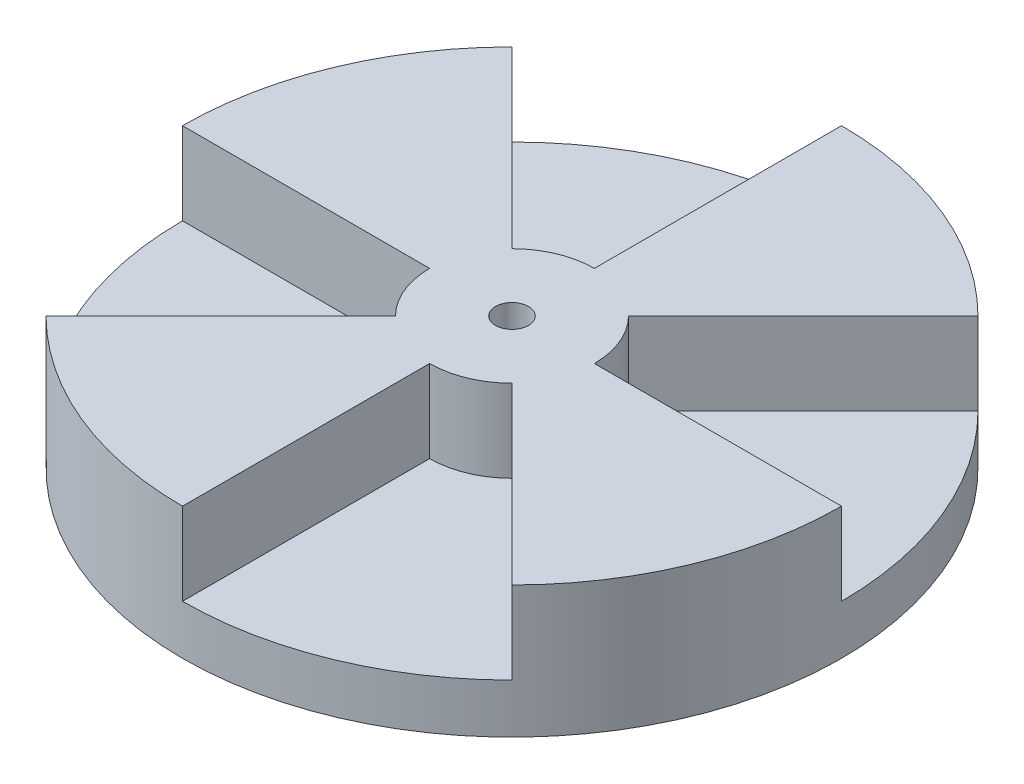
ISO-10303-21;
HEADER;
FILE_DESCRIPTION(('STEP AP214'),'2;1');
FILE_NAME('part.step','',(''),(''),'','','');
FILE_SCHEMA(('AUTOMOTIVE_DESIGN { 1 0 10303 214 1 1 1 1 }'));
ENDSEC;
DATA;
#1=APPLICATION_CONTEXT('core data for automotive mechanical design processes');
#2=APPLICATION_PROTOCOL_DEFINITION('international standard','automotive_design',2000,#1);
#3=PRODUCT_CONTEXT('',#1,'mechanical');
#4=PRODUCT('Part','Part','',(#3));
#5=PRODUCT_RELATED_PRODUCT_CATEGORY('part','',(#4));
#6=PRODUCT_DEFINITION_FORMATION('','',#4);
#7=PRODUCT_DEFINITION_CONTEXT('part definition',#1,'design');
#8=PRODUCT_DEFINITION('design','',#6,#7);
#9=PRODUCT_DEFINITION_SHAPE('','',#8);
#10=(LENGTH_UNIT() NAMED_UNIT(*) SI_UNIT(.MILLI.,.METRE.));
#11=(NAMED_UNIT(*) PLANE_ANGLE_UNIT() SI_UNIT($,.RADIAN.));
#12=(NAMED_UNIT(*) SI_UNIT($,.STERADIAN.) SOLID_ANGLE_UNIT());
#13=UNCERTAINTY_MEASURE_WITH_UNIT(LENGTH_MEASURE(1.E-05),#10,'distance_accuracy_value','');
#14=(GEOMETRIC_REPRESENTATION_CONTEXT(3) GLOBAL_UNCERTAINTY_ASSIGNED_CONTEXT((#13)) GLOBAL_UNIT_ASSIGNED_CONTEXT((#10,
#11,#12)) REPRESENTATION_CONTEXT('',''));
#15=CARTESIAN_POINT('',(0.,0.,0.));
#16=DIRECTION('',(0.,0.,1.));
#17=DIRECTION('',(1.,0.,0.));
#18=AXIS2_PLACEMENT_3D('',#15,#16,#17);
#19=CARTESIAN_POINT('',(0.,8.,0.));
#20=DIRECTION('',(0.,-1.,0.));
#21=DIRECTION('',(0.,0.,-1.));
#22=AXIS2_PLACEMENT_3D('',#19,#20,#21);
#23=CYLINDRICAL_SURFACE('',#22,20.);
#24=CARTESIAN_POINT('',(0.,0.,0.));
#25=DIRECTION('',(0.,1.,0.));
#26=DIRECTION('',(0.,0.,1.));
#27=AXIS2_PLACEMENT_3D('',#24,#25,#26);
#28=CIRCLE('',#27,20.);
#29=CARTESIAN_POINT('',(0.,0.,20.));
#30=VERTEX_POINT('',#29);
#31=EDGE_CURVE('E264',#30,#30,#28,.T.);
#32=ORIENTED_EDGE('',*,*,#31,.T.);
#33=EDGE_LOOP('',(#32));
#34=FACE_BOUND('',#33,.T.);
#35=DIRECTION('',(0.,1.,0.));
#36=VECTOR('',#35,1.);
#37=CARTESIAN_POINT('',(14.1421356237309,3.,-14.142135623731));
#38=LINE('',#37,#36);
#39=CARTESIAN_POINT('',(14.1421356237309,3.,-14.142135623731));
#40=VERTEX_POINT('',#39);
#41=CARTESIAN_POINT('',(14.1421356237309,8.,-14.142135623731));
#42=VERTEX_POINT('',#41);
#43=EDGE_CURVE('E181',#40,#42,#38,.T.);
#44=ORIENTED_EDGE('',*,*,#43,.F.);
#45=CARTESIAN_POINT('',(0.,3.,0.));
#46=DIRECTION('',(0.,1.,0.));
#47=DIRECTION('',(0.,0.,1.));
#48=AXIS2_PLACEMENT_3D('',#45,#46,#47);
#49=CIRCLE('',#48,20.);
#50=CARTESIAN_POINT('',(20.,3.,0.));
#51=VERTEX_POINT('',#50);
#52=EDGE_CURVE('E168',#51,#40,#49,.T.);
#53=ORIENTED_EDGE('',*,*,#52,.F.);
#54=DIRECTION('',(0.,1.,0.));
#55=VECTOR('',#54,1.);
#56=CARTESIAN_POINT('',(20.,3.,0.));
#57=LINE('',#56,#55);
#58=CARTESIAN_POINT('',(20.,8.,0.));
#59=VERTEX_POINT('',#58);
#60=EDGE_CURVE('E155',#51,#59,#57,.T.);
#61=ORIENTED_EDGE('',*,*,#60,.T.);
#62=CARTESIAN_POINT('',(0.,8.,0.));
#63=DIRECTION('',(0.,1.,0.));
#64=DIRECTION('',(0.,0.,1.));
#65=AXIS2_PLACEMENT_3D('',#62,#63,#64);
#66=CIRCLE('',#65,20.);
#67=CARTESIAN_POINT('',(14.142135623731,8.,14.1421356237309));
#68=VERTEX_POINT('',#67);
#69=EDGE_CURVE('E274',#68,#59,#66,.T.);
#70=ORIENTED_EDGE('',*,*,#69,.F.);
#71=DIRECTION('',(0.,1.,0.));
#72=VECTOR('',#71,1.);
#73=CARTESIAN_POINT('',(14.142135623731,3.,14.1421356237309));
#74=LINE('',#73,#72);
#75=CARTESIAN_POINT('',(14.142135623731,3.,14.1421356237309));
#76=VERTEX_POINT('',#75);
#77=EDGE_CURVE('E205',#76,#68,#74,.T.);
#78=ORIENTED_EDGE('',*,*,#77,.F.);
#79=CARTESIAN_POINT('',(0.,3.,0.));
#80=DIRECTION('',(0.,1.,0.));
#81=DIRECTION('',(0.,0.,1.));
#82=AXIS2_PLACEMENT_3D('',#79,#80,#81);
#83=CIRCLE('',#82,20.);
#84=CARTESIAN_POINT('',(0.,3.,20.));
#85=VERTEX_POINT('',#84);
#86=EDGE_CURVE('E191',#85,#76,#83,.T.);
#87=ORIENTED_EDGE('',*,*,#86,.F.);
#88=DIRECTION('',(0.,1.,0.));
#89=VECTOR('',#88,1.);
#90=CARTESIAN_POINT('',(0.,3.,20.));
#91=LINE('',#90,#89);
#92=CARTESIAN_POINT('',(0.,8.,20.));
#93=VERTEX_POINT('',#92);
#94=EDGE_CURVE('E207',#85,#93,#91,.T.);
#95=ORIENTED_EDGE('',*,*,#94,.T.);
#96=CARTESIAN_POINT('',(-14.1421356237309,8.,14.142135623731));
#97=VERTEX_POINT('',#96);
#98=EDGE_CURVE('E40',#97,#93,#66,.T.);
#99=ORIENTED_EDGE('',*,*,#98,.F.);
#100=DIRECTION('',(0.,1.,0.));
#101=VECTOR('',#100,1.);
#102=CARTESIAN_POINT('',(-14.1421356237309,3.,14.142135623731));
#103=LINE('',#102,#101);
#104=CARTESIAN_POINT('',(-14.1421356237309,3.,14.142135623731));
#105=VERTEX_POINT('',#104);
#106=EDGE_CURVE('E234',#105,#97,#103,.T.);
#107=ORIENTED_EDGE('',*,*,#106,.F.);
#108=CARTESIAN_POINT('',(0.,3.,0.));
#109=DIRECTION('',(0.,1.,0.));
#110=DIRECTION('',(0.,0.,1.));
#111=AXIS2_PLACEMENT_3D('',#108,#109,#110);
#112=CIRCLE('',#111,20.);
#113=CARTESIAN_POINT('',(-20.,3.,0.));
#114=VERTEX_POINT('',#113);
#115=EDGE_CURVE('E218',#114,#105,#112,.T.);
#116=ORIENTED_EDGE('',*,*,#115,.F.);
#117=DIRECTION('',(0.,1.,0.));
#118=VECTOR('',#117,1.);
#119=CARTESIAN_POINT('',(-20.,3.,0.));
#120=LINE('',#119,#118);
#121=CARTESIAN_POINT('',(-20.,8.,0.));
#122=VERTEX_POINT('',#121);
#123=EDGE_CURVE('E236',#114,#122,#120,.T.);
#124=ORIENTED_EDGE('',*,*,#123,.T.);
#125=CARTESIAN_POINT('',(-14.142135623731,8.,-14.1421356237309));
#126=VERTEX_POINT('',#125);
#127=EDGE_CURVE('E11',#126,#122,#66,.T.);
#128=ORIENTED_EDGE('',*,*,#127,.F.);
#129=DIRECTION('',(0.,1.,0.));
#130=VECTOR('',#129,1.);
#131=CARTESIAN_POINT('',(-14.142135623731,3.,-14.1421356237309));
#132=LINE('',#131,#130);
#133=CARTESIAN_POINT('',(-14.142135623731,3.,-14.1421356237309));
#134=VERTEX_POINT('',#133);
#135=EDGE_CURVE('E265',#134,#126,#132,.T.);
#136=ORIENTED_EDGE('',*,*,#135,.F.);
#137=CARTESIAN_POINT('',(0.,3.,0.));
#138=DIRECTION('',(0.,1.,0.));
#139=DIRECTION('',(0.,0.,1.));
#140=AXIS2_PLACEMENT_3D('',#137,#138,#139);
#141=CIRCLE('',#140,20.);
#142=CARTESIAN_POINT('',(0.,3.,-20.));
#143=VERTEX_POINT('',#142);
#144=EDGE_CURVE('E248',#143,#134,#141,.T.);
#145=ORIENTED_EDGE('',*,*,#144,.F.);
#146=DIRECTION('',(0.,1.,0.));
#147=VECTOR('',#146,1.);
#148=CARTESIAN_POINT('',(0.,3.,-20.));
#149=LINE('',#148,#147);
#150=CARTESIAN_POINT('',(0.,8.,-20.));
#151=VERTEX_POINT('',#150);
#152=EDGE_CURVE('E267',#143,#151,#149,.T.);
#153=ORIENTED_EDGE('',*,*,#152,.T.);
#154=EDGE_CURVE('E42',#42,#151,#66,.T.);
#155=ORIENTED_EDGE('',*,*,#154,.F.);
#156=EDGE_LOOP('',(#44,#53,#61,#70,#78,#87,#95,#99,#107,#116,#124,#128,#136,#145,#153,#155));
#157=FACE_BOUND('',#156,.T.);
#158=ADVANCED_FACE('F32',(#34,#157),#23,.T.);
#159=CARTESIAN_POINT('',(0.,8.,0.));
#160=DIRECTION('',(0.,1.,0.));
#161=DIRECTION('',(0.,0.,1.));
#162=AXIS2_PLACEMENT_3D('',#159,#160,#161);
#163=PLANE('',#162);
#164=CARTESIAN_POINT('',(0.,8.,0.));
#165=DIRECTION('',(0.,1.,0.));
#166=DIRECTION('',(0.,0.,1.));
#167=AXIS2_PLACEMENT_3D('',#164,#165,#166);
#168=CIRCLE('',#167,1.);
#169=CARTESIAN_POINT('',(0.,8.,1.));
#170=VERTEX_POINT('',#169);
#171=EDGE_CURVE('E415',#170,#170,#168,.T.);
#172=ORIENTED_EDGE('',*,*,#171,.F.);
#173=EDGE_LOOP('',(#172));
#174=FACE_BOUND('',#173,.T.);
#175=CARTESIAN_POINT('',(0.,8.,0.));
#176=DIRECTION('',(0.,1.,0.));
#177=DIRECTION('',(0.,0.,1.));
#178=AXIS2_PLACEMENT_3D('',#175,#176,#177);
#179=CIRCLE('',#178,5.);
#180=CARTESIAN_POINT('',(5.,8.,0.));
#181=VERTEX_POINT('',#180);
#182=CARTESIAN_POINT('',(3.53553390593273,8.,-3.53553390593275));
#183=VERTEX_POINT('',#182);
#184=EDGE_CURVE('E49',#181,#183,#179,.T.);
#185=ORIENTED_EDGE('',*,*,#184,.T.);
#186=DIRECTION('',(0.707106781186546,0.,-0.707106781186549));
#187=VECTOR('',#186,1.);
#188=CARTESIAN_POINT('',(0.,8.,0.));
#189=LINE('',#188,#187);
#190=EDGE_CURVE('E164',#183,#42,#189,.T.);
#191=ORIENTED_EDGE('',*,*,#190,.T.);
#192=ORIENTED_EDGE('',*,*,#154,.T.);
#193=DIRECTION('',(0.,0.,-1.));
#194=VECTOR('',#193,1.);
#195=CARTESIAN_POINT('',(0.,8.,0.));
#196=LINE('',#195,#194);
#197=CARTESIAN_POINT('',(0.,8.,-5.));
#198=VERTEX_POINT('',#197);
#199=EDGE_CURVE('E256',#198,#151,#196,.T.);
#200=ORIENTED_EDGE('',*,*,#199,.F.);
#201=CARTESIAN_POINT('',(0.,8.,0.));
#202=DIRECTION('',(0.,1.,0.));
#203=DIRECTION('',(0.,0.,1.));
#204=AXIS2_PLACEMENT_3D('',#201,#202,#203);
#205=CIRCLE('',#204,5.);
#206=CARTESIAN_POINT('',(-3.53553390593274,8.,-3.53553390593273));
#207=VERTEX_POINT('',#206);
#208=EDGE_CURVE('E233',#198,#207,#205,.T.);
#209=ORIENTED_EDGE('',*,*,#208,.T.);
#210=DIRECTION('',(-0.707106781186549,0.,-0.707106781186546));
#211=VECTOR('',#210,1.);
#212=CARTESIAN_POINT('',(0.,8.,0.));
#213=LINE('',#212,#211);
#214=EDGE_CURVE('E245',#207,#126,#213,.T.);
#215=ORIENTED_EDGE('',*,*,#214,.T.);
#216=ORIENTED_EDGE('',*,*,#127,.T.);
#217=DIRECTION('',(-1.,0.,0.));
#218=VECTOR('',#217,1.);
#219=CARTESIAN_POINT('',(0.,8.,0.));
#220=LINE('',#219,#218);
#221=CARTESIAN_POINT('',(-5.,8.,0.));
#222=VERTEX_POINT('',#221);
#223=EDGE_CURVE('E226',#222,#122,#220,.T.);
#224=ORIENTED_EDGE('',*,*,#223,.F.);
#225=CARTESIAN_POINT('',(0.,8.,0.));
#226=DIRECTION('',(0.,1.,0.));
#227=DIRECTION('',(0.,0.,1.));
#228=AXIS2_PLACEMENT_3D('',#225,#226,#227);
#229=CIRCLE('',#228,5.);
#230=CARTESIAN_POINT('',(-3.53553390593273,8.,3.53553390593275));
#231=VERTEX_POINT('',#230);
#232=EDGE_CURVE('E204',#222,#231,#229,.T.);
#233=ORIENTED_EDGE('',*,*,#232,.T.);
#234=DIRECTION('',(-0.707106781186546,0.,0.707106781186549));
#235=VECTOR('',#234,1.);
#236=CARTESIAN_POINT('',(0.,8.,0.));
#237=LINE('',#236,#235);
#238=EDGE_CURVE('E215',#231,#97,#237,.T.);
#239=ORIENTED_EDGE('',*,*,#238,.T.);
#240=ORIENTED_EDGE('',*,*,#98,.T.);
#241=DIRECTION('',(0.,0.,1.));
#242=VECTOR('',#241,1.);
#243=CARTESIAN_POINT('',(0.,8.,0.));
#244=LINE('',#243,#242);
#245=CARTESIAN_POINT('',(0.,8.,5.));
#246=VERTEX_POINT('',#245);
#247=EDGE_CURVE('E198',#246,#93,#244,.T.);
#248=ORIENTED_EDGE('',*,*,#247,.F.);
#249=CARTESIAN_POINT('',(0.,8.,0.));
#250=DIRECTION('',(0.,1.,0.));
#251=DIRECTION('',(0.,0.,1.));
#252=AXIS2_PLACEMENT_3D('',#249,#250,#251);
#253=CIRCLE('',#252,5.);
#254=CARTESIAN_POINT('',(3.53553390593275,8.,3.53553390593273));
#255=VERTEX_POINT('',#254);
#256=EDGE_CURVE('E57',#246,#255,#253,.T.);
#257=ORIENTED_EDGE('',*,*,#256,.T.);
#258=DIRECTION('',(0.707106781186549,0.,0.707106781186546));
#259=VECTOR('',#258,1.);
#260=CARTESIAN_POINT('',(0.,8.,0.));
#261=LINE('',#260,#259);
#262=EDGE_CURVE('E188',#255,#68,#261,.T.);
#263=ORIENTED_EDGE('',*,*,#262,.T.);
#264=ORIENTED_EDGE('',*,*,#69,.T.);
#265=DIRECTION('',(1.,0.,0.));
#266=VECTOR('',#265,1.);
#267=CARTESIAN_POINT('',(0.,8.,0.));
#268=LINE('',#267,#266);
#269=EDGE_CURVE('E175',#181,#59,#268,.T.);
#270=ORIENTED_EDGE('',*,*,#269,.F.);
#271=EDGE_LOOP('',(#185,#191,#192,#200,#209,#215,#216,#224,#233,#239,#240,#248,#257,#263,#264,#270));
#272=FACE_BOUND('',#271,.T.);
#273=ADVANCED_FACE('F283',(#174,#272),#163,.T.);
#274=CARTESIAN_POINT('',(0.,0.,0.));
#275=DIRECTION('',(0.,1.,0.));
#276=DIRECTION('',(0.,0.,1.));
#277=AXIS2_PLACEMENT_3D('',#274,#275,#276);
#278=PLANE('',#277);
#279=CARTESIAN_POINT('',(0.,0.,0.));
#280=DIRECTION('',(0.,1.,0.));
#281=DIRECTION('',(0.,0.,1.));
#282=AXIS2_PLACEMENT_3D('',#279,#280,#281);
#283=CIRCLE('',#282,1.);
#284=CARTESIAN_POINT('',(0.,0.,1.));
#285=VERTEX_POINT('',#284);
#286=EDGE_CURVE('E35',#285,#285,#283,.T.);
#287=ORIENTED_EDGE('',*,*,#286,.T.);
#288=EDGE_LOOP('',(#287));
#289=FACE_BOUND('',#288,.T.);
#290=ORIENTED_EDGE('',*,*,#31,.F.);
#291=EDGE_LOOP('',(#290));
#292=FACE_BOUND('',#291,.T.);
#293=ADVANCED_FACE('F315',(#289,#292),#278,.F.);
#294=CARTESIAN_POINT('',(0.,3.,0.));
#295=DIRECTION('',(0.,1.,0.));
#296=DIRECTION('',(0.,0.,1.));
#297=AXIS2_PLACEMENT_3D('',#294,#295,#296);
#298=CYLINDRICAL_SURFACE('',#297,5.);
#299=ORIENTED_EDGE('',*,*,#208,.F.);
#300=DIRECTION('',(0.,1.,0.));
#301=VECTOR('',#300,1.);
#302=CARTESIAN_POINT('',(0.,3.,-5.));
#303=LINE('',#302,#301);
#304=CARTESIAN_POINT('',(0.,3.,-5.));
#305=VERTEX_POINT('',#304);
#306=EDGE_CURVE('E253',#305,#198,#303,.T.);
#307=ORIENTED_EDGE('',*,*,#306,.F.);
#308=CARTESIAN_POINT('',(0.,3.,0.));
#309=DIRECTION('',(0.,1.,0.));
#310=DIRECTION('',(0.,0.,1.));
#311=AXIS2_PLACEMENT_3D('',#308,#309,#310);
#312=CIRCLE('',#311,5.);
#313=CARTESIAN_POINT('',(-3.53553390593274,3.,-3.53553390593273));
#314=VERTEX_POINT('',#313);
#315=EDGE_CURVE('E241',#305,#314,#312,.T.);
#316=ORIENTED_EDGE('',*,*,#315,.T.);
#317=DIRECTION('',(0.,1.,0.));
#318=VECTOR('',#317,1.);
#319=CARTESIAN_POINT('',(-3.53553390593274,3.,-3.53553390593273));
#320=LINE('',#319,#318);
#321=EDGE_CURVE('E261',#314,#207,#320,.T.);
#322=ORIENTED_EDGE('',*,*,#321,.T.);
#323=EDGE_LOOP('',(#299,#307,#316,#322));
#324=FACE_BOUND('',#323,.T.);
#325=ADVANCED_FACE('F321',(#324),#298,.T.);
#326=CARTESIAN_POINT('',(0.,3.,0.));
#327=DIRECTION('',(0.707106781186546,0.,-0.707106781186549));
#328=DIRECTION('',(-0.707106781186549,0.,-0.707106781186546));
#329=AXIS2_PLACEMENT_3D('',#326,#327,#328);
#330=PLANE('',#329);
#331=ORIENTED_EDGE('',*,*,#214,.F.);
#332=ORIENTED_EDGE('',*,*,#321,.F.);
#333=DIRECTION('',(-0.707106781186549,0.,-0.707106781186546));
#334=VECTOR('',#333,1.);
#335=CARTESIAN_POINT('',(0.,3.,0.));
#336=LINE('',#335,#334);
#337=EDGE_CURVE('E251',#314,#134,#336,.T.);
#338=ORIENTED_EDGE('',*,*,#337,.T.);
#339=ORIENTED_EDGE('',*,*,#135,.T.);
#340=EDGE_LOOP('',(#331,#332,#338,#339));
#341=FACE_BOUND('',#340,.T.);
#342=ADVANCED_FACE('F327',(#341),#330,.T.);
#343=CARTESIAN_POINT('',(0.,3.,0.));
#344=DIRECTION('',(1.,0.,0.));
#345=DIRECTION('',(0.,0.,-1.));
#346=AXIS2_PLACEMENT_3D('',#343,#344,#345);
#347=PLANE('',#346);
#348=ORIENTED_EDGE('',*,*,#199,.T.);
#349=ORIENTED_EDGE('',*,*,#152,.F.);
#350=DIRECTION('',(0.,0.,-1.));
#351=VECTOR('',#350,1.);
#352=CARTESIAN_POINT('',(0.,3.,0.));
#353=LINE('',#352,#351);
#354=EDGE_CURVE('E244',#305,#143,#353,.T.);
#355=ORIENTED_EDGE('',*,*,#354,.F.);
#356=ORIENTED_EDGE('',*,*,#306,.T.);
#357=EDGE_LOOP('',(#348,#349,#355,#356));
#358=FACE_BOUND('',#357,.T.);
#359=ADVANCED_FACE('F329',(#358),#347,.F.);
#360=CARTESIAN_POINT('',(0.,3.,0.));
#361=DIRECTION('',(0.,1.,0.));
#362=DIRECTION('',(0.,0.,1.));
#363=AXIS2_PLACEMENT_3D('',#360,#361,#362);
#364=PLANE('',#363);
#365=ORIENTED_EDGE('',*,*,#315,.F.);
#366=ORIENTED_EDGE('',*,*,#354,.T.);
#367=ORIENTED_EDGE('',*,*,#144,.T.);
#368=ORIENTED_EDGE('',*,*,#337,.F.);
#369=EDGE_LOOP('',(#365,#366,#367,#368));
#370=FACE_BOUND('',#369,.T.);
#371=ADVANCED_FACE('F332',(#370),#364,.T.);
#372=CARTESIAN_POINT('',(0.,3.,0.));
#373=DIRECTION('',(0.,1.,0.));
#374=DIRECTION('',(0.,0.,1.));
#375=AXIS2_PLACEMENT_3D('',#372,#373,#374);
#376=CYLINDRICAL_SURFACE('',#375,5.);
#377=ORIENTED_EDGE('',*,*,#232,.F.);
#378=DIRECTION('',(0.,1.,0.));
#379=VECTOR('',#378,1.);
#380=CARTESIAN_POINT('',(-5.,3.,0.));
#381=LINE('',#380,#379);
#382=CARTESIAN_POINT('',(-5.,3.,0.));
#383=VERTEX_POINT('',#382);
#384=EDGE_CURVE('E223',#383,#222,#381,.T.);
#385=ORIENTED_EDGE('',*,*,#384,.F.);
#386=CARTESIAN_POINT('',(0.,3.,0.));
#387=DIRECTION('',(0.,1.,0.));
#388=DIRECTION('',(0.,0.,1.));
#389=AXIS2_PLACEMENT_3D('',#386,#387,#388);
#390=CIRCLE('',#389,5.);
#391=CARTESIAN_POINT('',(-3.53553390593273,3.,3.53553390593275));
#392=VERTEX_POINT('',#391);
#393=EDGE_CURVE('E211',#383,#392,#390,.T.);
#394=ORIENTED_EDGE('',*,*,#393,.T.);
#395=DIRECTION('',(0.,1.,0.));
#396=VECTOR('',#395,1.);
#397=CARTESIAN_POINT('',(-3.53553390593273,3.,3.53553390593275));
#398=LINE('',#397,#396);
#399=EDGE_CURVE('E230',#392,#231,#398,.T.);
#400=ORIENTED_EDGE('',*,*,#399,.T.);
#401=EDGE_LOOP('',(#377,#385,#394,#400));
#402=FACE_BOUND('',#401,.T.);
#403=ADVANCED_FACE('F339',(#402),#376,.T.);
#404=CARTESIAN_POINT('',(0.,3.,0.));
#405=DIRECTION('',(-0.707106781186549,0.,-0.707106781186546));
#406=DIRECTION('',(-0.707106781186546,0.,0.707106781186549));
#407=AXIS2_PLACEMENT_3D('',#404,#405,#406);
#408=PLANE('',#407);
#409=ORIENTED_EDGE('',*,*,#238,.F.);
#410=ORIENTED_EDGE('',*,*,#399,.F.);
#411=DIRECTION('',(-0.707106781186546,0.,0.707106781186549));
#412=VECTOR('',#411,1.);
#413=CARTESIAN_POINT('',(0.,3.,0.));
#414=LINE('',#413,#412);
#415=EDGE_CURVE('E221',#392,#105,#414,.T.);
#416=ORIENTED_EDGE('',*,*,#415,.T.);
#417=ORIENTED_EDGE('',*,*,#106,.T.);
#418=EDGE_LOOP('',(#409,#410,#416,#417));
#419=FACE_BOUND('',#418,.T.);
#420=ADVANCED_FACE('F343',(#419),#408,.T.);
#421=CARTESIAN_POINT('',(0.,3.,0.));
#422=DIRECTION('',(0.,0.,-1.));
#423=DIRECTION('',(-1.,0.,0.));
#424=AXIS2_PLACEMENT_3D('',#421,#422,#423);
#425=PLANE('',#424);
#426=ORIENTED_EDGE('',*,*,#223,.T.);
#427=ORIENTED_EDGE('',*,*,#123,.F.);
#428=DIRECTION('',(-1.,0.,0.));
#429=VECTOR('',#428,1.);
#430=CARTESIAN_POINT('',(0.,3.,0.));
#431=LINE('',#430,#429);
#432=EDGE_CURVE('E214',#383,#114,#431,.T.);
#433=ORIENTED_EDGE('',*,*,#432,.F.);
#434=ORIENTED_EDGE('',*,*,#384,.T.);
#435=EDGE_LOOP('',(#426,#427,#433,#434));
#436=FACE_BOUND('',#435,.T.);
#437=ADVANCED_FACE('F345',(#436),#425,.F.);
#438=CARTESIAN_POINT('',(0.,3.,0.));
#439=DIRECTION('',(0.,1.,0.));
#440=DIRECTION('',(0.,0.,1.));
#441=AXIS2_PLACEMENT_3D('',#438,#439,#440);
#442=PLANE('',#441);
#443=ORIENTED_EDGE('',*,*,#393,.F.);
#444=ORIENTED_EDGE('',*,*,#432,.T.);
#445=ORIENTED_EDGE('',*,*,#115,.T.);
#446=ORIENTED_EDGE('',*,*,#415,.F.);
#447=EDGE_LOOP('',(#443,#444,#445,#446));
#448=FACE_BOUND('',#447,.T.);
#449=ADVANCED_FACE('F348',(#448),#442,.T.);
#450=CARTESIAN_POINT('',(0.,3.,0.));
#451=DIRECTION('',(0.,1.,0.));
#452=DIRECTION('',(0.,0.,1.));
#453=AXIS2_PLACEMENT_3D('',#450,#451,#452);
#454=CYLINDRICAL_SURFACE('',#453,5.);
#455=ORIENTED_EDGE('',*,*,#256,.F.);
#456=DIRECTION('',(0.,1.,0.));
#457=VECTOR('',#456,1.);
#458=CARTESIAN_POINT('',(0.,3.,5.));
#459=LINE('',#458,#457);
#460=CARTESIAN_POINT('',(0.,3.,5.));
#461=VERTEX_POINT('',#460);
#462=EDGE_CURVE('E196',#461,#246,#459,.T.);
#463=ORIENTED_EDGE('',*,*,#462,.F.);
#464=CARTESIAN_POINT('',(0.,3.,0.));
#465=DIRECTION('',(0.,1.,0.));
#466=DIRECTION('',(0.,0.,1.));
#467=AXIS2_PLACEMENT_3D('',#464,#465,#466);
#468=CIRCLE('',#467,5.);
#469=CARTESIAN_POINT('',(3.53553390593275,3.,3.53553390593273));
#470=VERTEX_POINT('',#469);
#471=EDGE_CURVE('E184',#461,#470,#468,.T.);
#472=ORIENTED_EDGE('',*,*,#471,.T.);
#473=DIRECTION('',(0.,1.,0.));
#474=VECTOR('',#473,1.);
#475=CARTESIAN_POINT('',(3.53553390593275,3.,3.53553390593273));
#476=LINE('',#475,#474);
#477=EDGE_CURVE('E202',#470,#255,#476,.T.);
#478=ORIENTED_EDGE('',*,*,#477,.T.);
#479=EDGE_LOOP('',(#455,#463,#472,#478));
#480=FACE_BOUND('',#479,.T.);
#481=ADVANCED_FACE('F297',(#480),#454,.T.);
#482=CARTESIAN_POINT('',(0.,3.,0.));
#483=DIRECTION('',(-0.707106781186546,0.,0.707106781186549));
#484=DIRECTION('',(0.707106781186549,0.,0.707106781186546));
#485=AXIS2_PLACEMENT_3D('',#482,#483,#484);
#486=PLANE('',#485);
#487=ORIENTED_EDGE('',*,*,#262,.F.);
#488=ORIENTED_EDGE('',*,*,#477,.F.);
#489=DIRECTION('',(0.707106781186549,0.,0.707106781186546));
#490=VECTOR('',#489,1.);
#491=CARTESIAN_POINT('',(0.,3.,0.));
#492=LINE('',#491,#490);
#493=EDGE_CURVE('E194',#470,#76,#492,.T.);
#494=ORIENTED_EDGE('',*,*,#493,.T.);
#495=ORIENTED_EDGE('',*,*,#77,.T.);
#496=EDGE_LOOP('',(#487,#488,#494,#495));
#497=FACE_BOUND('',#496,.T.);
#498=ADVANCED_FACE('F299',(#497),#486,.T.);
#499=CARTESIAN_POINT('',(0.,3.,0.));
#500=DIRECTION('',(-1.,0.,0.));
#501=DIRECTION('',(0.,0.,1.));
#502=AXIS2_PLACEMENT_3D('',#499,#500,#501);
#503=PLANE('',#502);
#504=ORIENTED_EDGE('',*,*,#247,.T.);
#505=ORIENTED_EDGE('',*,*,#94,.F.);
#506=DIRECTION('',(0.,0.,1.));
#507=VECTOR('',#506,1.);
#508=CARTESIAN_POINT('',(0.,3.,0.));
#509=LINE('',#508,#507);
#510=EDGE_CURVE('E187',#461,#85,#509,.T.);
#511=ORIENTED_EDGE('',*,*,#510,.F.);
#512=ORIENTED_EDGE('',*,*,#462,.T.);
#513=EDGE_LOOP('',(#504,#505,#511,#512));
#514=FACE_BOUND('',#513,.T.);
#515=ADVANCED_FACE('F292',(#514),#503,.F.);
#516=CARTESIAN_POINT('',(0.,3.,0.));
#517=DIRECTION('',(0.,1.,0.));
#518=DIRECTION('',(0.,0.,1.));
#519=AXIS2_PLACEMENT_3D('',#516,#517,#518);
#520=PLANE('',#519);
#521=ORIENTED_EDGE('',*,*,#471,.F.);
#522=ORIENTED_EDGE('',*,*,#510,.T.);
#523=ORIENTED_EDGE('',*,*,#86,.T.);
#524=ORIENTED_EDGE('',*,*,#493,.F.);
#525=EDGE_LOOP('',(#521,#522,#523,#524));
#526=FACE_BOUND('',#525,.T.);
#527=ADVANCED_FACE('F295',(#526),#520,.T.);
#528=CARTESIAN_POINT('',(0.,3.,0.));
#529=DIRECTION('',(0.,1.,0.));
#530=DIRECTION('',(0.,0.,1.));
#531=AXIS2_PLACEMENT_3D('',#528,#529,#530);
#532=CYLINDRICAL_SURFACE('',#531,5.);
#533=ORIENTED_EDGE('',*,*,#184,.F.);
#534=DIRECTION('',(0.,1.,0.));
#535=VECTOR('',#534,1.);
#536=CARTESIAN_POINT('',(5.,3.,0.));
#537=LINE('',#536,#535);
#538=CARTESIAN_POINT('',(5.,3.,0.));
#539=VERTEX_POINT('',#538);
#540=EDGE_CURVE('E147',#539,#181,#537,.T.);
#541=ORIENTED_EDGE('',*,*,#540,.F.);
#542=CARTESIAN_POINT('',(0.,3.,0.));
#543=DIRECTION('',(0.,1.,0.));
#544=DIRECTION('',(0.,0.,1.));
#545=AXIS2_PLACEMENT_3D('',#542,#543,#544);
#546=CIRCLE('',#545,5.);
#547=CARTESIAN_POINT('',(3.53553390593273,3.,-3.53553390593275));
#548=VERTEX_POINT('',#547);
#549=EDGE_CURVE('E150',#539,#548,#546,.T.);
#550=ORIENTED_EDGE('',*,*,#549,.T.);
#551=DIRECTION('',(0.,1.,0.));
#552=VECTOR('',#551,1.);
#553=CARTESIAN_POINT('',(3.53553390593273,3.,-3.53553390593275));
#554=LINE('',#553,#552);
#555=EDGE_CURVE('E179',#548,#183,#554,.T.);
#556=ORIENTED_EDGE('',*,*,#555,.T.);
#557=EDGE_LOOP('',(#533,#541,#550,#556));
#558=FACE_BOUND('',#557,.T.);
#559=ADVANCED_FACE('F149',(#558),#532,.T.);
#560=CARTESIAN_POINT('',(0.,3.,0.));
#561=DIRECTION('',(0.707106781186549,0.,0.707106781186546));
#562=DIRECTION('',(0.707106781186546,0.,-0.707106781186549));
#563=AXIS2_PLACEMENT_3D('',#560,#561,#562);
#564=PLANE('',#563);
#565=ORIENTED_EDGE('',*,*,#190,.F.);
#566=ORIENTED_EDGE('',*,*,#555,.F.);
#567=DIRECTION('',(0.707106781186546,0.,-0.707106781186549));
#568=VECTOR('',#567,1.);
#569=CARTESIAN_POINT('',(0.,3.,0.));
#570=LINE('',#569,#568);
#571=EDGE_CURVE('E156',#548,#40,#570,.T.);
#572=ORIENTED_EDGE('',*,*,#571,.T.);
#573=ORIENTED_EDGE('',*,*,#43,.T.);
#574=EDGE_LOOP('',(#565,#566,#572,#573));
#575=FACE_BOUND('',#574,.T.);
#576=ADVANCED_FACE('F301',(#575),#564,.T.);
#577=CARTESIAN_POINT('',(0.,3.,0.));
#578=DIRECTION('',(0.,0.,1.));
#579=DIRECTION('',(1.,0.,0.));
#580=AXIS2_PLACEMENT_3D('',#577,#578,#579);
#581=PLANE('',#580);
#582=ORIENTED_EDGE('',*,*,#269,.T.);
#583=ORIENTED_EDGE('',*,*,#60,.F.);
#584=DIRECTION('',(1.,0.,0.));
#585=VECTOR('',#584,1.);
#586=CARTESIAN_POINT('',(0.,3.,0.));
#587=LINE('',#586,#585);
#588=EDGE_CURVE('E162',#539,#51,#587,.T.);
#589=ORIENTED_EDGE('',*,*,#588,.F.);
#590=ORIENTED_EDGE('',*,*,#540,.T.);
#591=EDGE_LOOP('',(#582,#583,#589,#590));
#592=FACE_BOUND('',#591,.T.);
#593=ADVANCED_FACE('F166',(#592),#581,.F.);
#594=CARTESIAN_POINT('',(0.,3.,0.));
#595=DIRECTION('',(0.,1.,0.));
#596=DIRECTION('',(0.,0.,1.));
#597=AXIS2_PLACEMENT_3D('',#594,#595,#596);
#598=PLANE('',#597);
#599=ORIENTED_EDGE('',*,*,#549,.F.);
#600=ORIENTED_EDGE('',*,*,#588,.T.);
#601=ORIENTED_EDGE('',*,*,#52,.T.);
#602=ORIENTED_EDGE('',*,*,#571,.F.);
#603=EDGE_LOOP('',(#599,#600,#601,#602));
#604=FACE_BOUND('',#603,.T.);
#605=ADVANCED_FACE('F160',(#604),#598,.T.);
#606=CARTESIAN_POINT('',(0.,-2.,0.));
#607=DIRECTION('',(0.,1.,0.));
#608=DIRECTION('',(0.,0.,1.));
#609=AXIS2_PLACEMENT_3D('',#606,#607,#608);
#610=CYLINDRICAL_SURFACE('',#609,1.);
#611=ORIENTED_EDGE('',*,*,#171,.T.);
#612=EDGE_LOOP('',(#611));
#613=FACE_BOUND('',#612,.T.);
#614=ORIENTED_EDGE('',*,*,#286,.F.);
#615=EDGE_LOOP('',(#614));
#616=FACE_BOUND('',#615,.T.);
#617=ADVANCED_FACE('F389',(#613,#616),#610,.F.);
#618=CLOSED_SHELL('',(#158,#273,#293,#325,#342,#359,#371,#403,#420,#437,#449,#481,#498,#515,
#527,#559,#576,#593,#605,#617));
#619=MANIFOLD_SOLID_BREP('B2',#618);
#620=ADVANCED_BREP_SHAPE_REPRESENTATION('',(#18,#619),#14);
#621=SHAPE_DEFINITION_REPRESENTATION(#9,#620);
ENDSEC;
END-ISO-10303-21;
